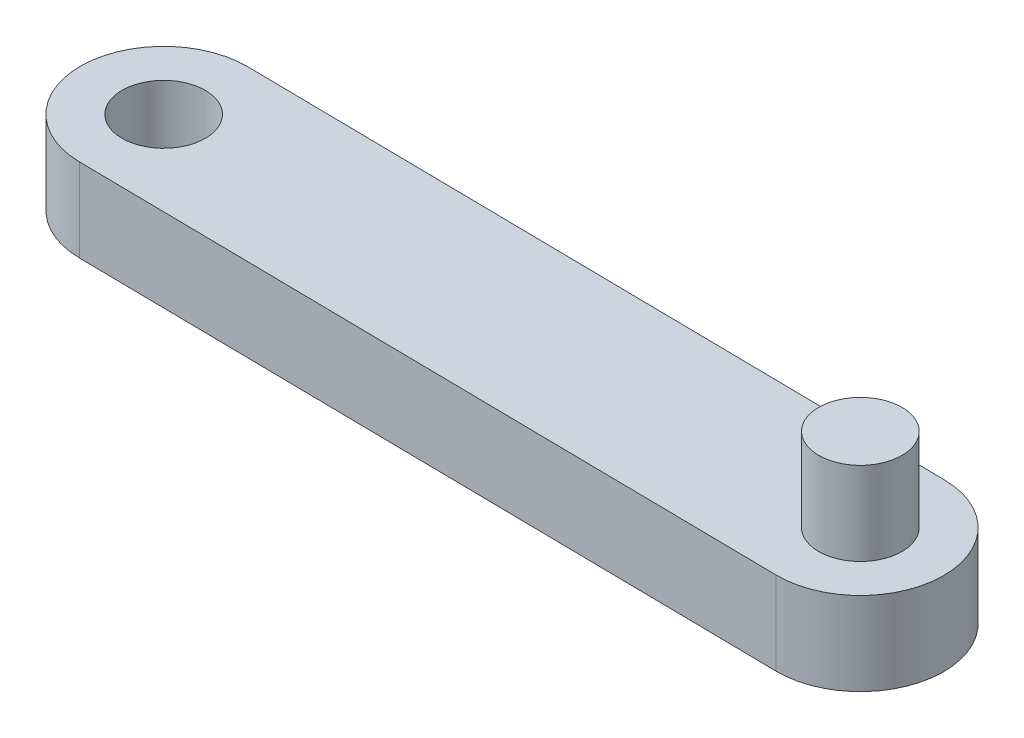
ISO-10303-21;
HEADER;
FILE_DESCRIPTION(('STEP AP214'),'2;1');
FILE_NAME('part.step','',(''),(''),'','','');
FILE_SCHEMA(('AUTOMOTIVE_DESIGN { 1 0 10303 214 1 1 1 1 }'));
ENDSEC;
DATA;
#1=APPLICATION_CONTEXT('core data for automotive mechanical design processes');
#2=APPLICATION_PROTOCOL_DEFINITION('international standard','automotive_design',2000,#1);
#3=PRODUCT_CONTEXT('',#1,'mechanical');
#4=PRODUCT('Part','Part','',(#3));
#5=PRODUCT_RELATED_PRODUCT_CATEGORY('part','',(#4));
#6=PRODUCT_DEFINITION_FORMATION('','',#4);
#7=PRODUCT_DEFINITION_CONTEXT('part definition',#1,'design');
#8=PRODUCT_DEFINITION('design','',#6,#7);
#9=PRODUCT_DEFINITION_SHAPE('','',#8);
#10=(LENGTH_UNIT() NAMED_UNIT(*) SI_UNIT(.MILLI.,.METRE.));
#11=(NAMED_UNIT(*) PLANE_ANGLE_UNIT() SI_UNIT($,.RADIAN.));
#12=(NAMED_UNIT(*) SI_UNIT($,.STERADIAN.) SOLID_ANGLE_UNIT());
#13=UNCERTAINTY_MEASURE_WITH_UNIT(LENGTH_MEASURE(1.E-05),#10,'distance_accuracy_value','');
#14=(GEOMETRIC_REPRESENTATION_CONTEXT(3) GLOBAL_UNCERTAINTY_ASSIGNED_CONTEXT((#13)) GLOBAL_UNIT_ASSIGNED_CONTEXT((#10,
#11,#12)) REPRESENTATION_CONTEXT('',''));
#15=CARTESIAN_POINT('',(0.,0.,0.));
#16=DIRECTION('',(0.,0.,1.));
#17=DIRECTION('',(1.,0.,0.));
#18=AXIS2_PLACEMENT_3D('',#15,#16,#17);
#19=CARTESIAN_POINT('',(-14.5716160355899,5.,-1.70714880270089));
#20=DIRECTION('',(0.,1.,0.));
#21=DIRECTION('',(0.,0.,1.));
#22=AXIS2_PLACEMENT_3D('',#19,#20,#21);
#23=PLANE('',#22);
#24=CARTESIAN_POINT('',(27.8283839644101,5.,-1.1374750982863));
#25=DIRECTION('',(0.,1.,0.));
#26=DIRECTION('',(0.,0.,1.));
#27=AXIS2_PLACEMENT_3D('',#24,#25,#26);
#28=CIRCLE('',#27,2.5);
#29=CARTESIAN_POINT('',(27.8283839644101,5.,1.3625249017137));
#30=VERTEX_POINT('',#29);
#31=EDGE_CURVE('E118',#30,#30,#28,.T.);
#32=ORIENTED_EDGE('',*,*,#31,.F.);
#33=EDGE_LOOP('',(#32));
#34=FACE_BOUND('',#33,.T.);
#35=CARTESIAN_POINT('',(-14.5716160355899,5.,-1.70714880270089));
#36=DIRECTION('',(0.,1.,0.));
#37=DIRECTION('',(0.,0.,1.));
#38=AXIS2_PLACEMENT_3D('',#35,#36,#37);
#39=CIRCLE('',#38,5.);
#40=CARTESIAN_POINT('',(-14.5044435953561,5.,-6.70669756866698));
#41=VERTEX_POINT('',#40);
#42=CARTESIAN_POINT('',(-14.6387884758236,5.,3.2923999632652));
#43=VERTEX_POINT('',#42);
#44=EDGE_CURVE('E85',#41,#43,#39,.T.);
#45=ORIENTED_EDGE('',*,*,#44,.T.);
#46=DIRECTION('',(0.999909753193218,0.,0.013434488046742));
#47=VECTOR('',#46,1.);
#48=CARTESIAN_POINT('',(-14.6387884758236,5.,3.2923999632652));
#49=LINE('',#48,#47);
#50=CARTESIAN_POINT('',(27.7612115241764,5.,3.86207366767979));
#51=VERTEX_POINT('',#50);
#52=EDGE_CURVE('E80',#43,#51,#49,.T.);
#53=ORIENTED_EDGE('',*,*,#52,.T.);
#54=CARTESIAN_POINT('',(27.8283839644101,5.,-1.1374750982863));
#55=DIRECTION('',(0.,1.,0.));
#56=DIRECTION('',(0.,0.,1.));
#57=AXIS2_PLACEMENT_3D('',#54,#55,#56);
#58=CIRCLE('',#57,5.);
#59=CARTESIAN_POINT('',(27.8955564046438,5.,-6.13702386425239));
#60=VERTEX_POINT('',#59);
#61=EDGE_CURVE('E83',#51,#60,#58,.T.);
#62=ORIENTED_EDGE('',*,*,#61,.T.);
#63=DIRECTION('',(-0.999909753193218,0.,-0.013434488046742));
#64=VECTOR('',#63,1.);
#65=CARTESIAN_POINT('',(-14.5044435953561,5.,-6.70669756866698));
#66=LINE('',#65,#64);
#67=EDGE_CURVE('E50',#60,#41,#66,.T.);
#68=ORIENTED_EDGE('',*,*,#67,.T.);
#69=EDGE_LOOP('',(#45,#53,#62,#68));
#70=FACE_BOUND('',#69,.T.);
#71=CARTESIAN_POINT('',(-14.5716160355899,5.,-1.70714880270089));
#72=DIRECTION('',(0.,1.,0.));
#73=DIRECTION('',(0.,0.,1.));
#74=AXIS2_PLACEMENT_3D('',#71,#72,#73);
#75=CIRCLE('',#74,2.5);
#76=CARTESIAN_POINT('',(-14.5716160355899,5.,0.792851197299112));
#77=VERTEX_POINT('',#76);
#78=EDGE_CURVE('E100',#77,#77,#75,.T.);
#79=ORIENTED_EDGE('',*,*,#78,.F.);
#80=EDGE_LOOP('',(#79));
#81=FACE_BOUND('',#80,.T.);
#82=ADVANCED_FACE('F33',(#34,#70,#81),#23,.T.);
#83=CARTESIAN_POINT('',(-14.5716160355899,0.,-1.70714880270089));
#84=DIRECTION('',(0.,1.,0.));
#85=DIRECTION('',(0.,0.,1.));
#86=AXIS2_PLACEMENT_3D('',#83,#84,#85);
#87=PLANE('',#86);
#88=CARTESIAN_POINT('',(-14.5716160355899,0.,-1.70714880270089));
#89=DIRECTION('',(0.,1.,0.));
#90=DIRECTION('',(0.,0.,1.));
#91=AXIS2_PLACEMENT_3D('',#88,#89,#90);
#92=CIRCLE('',#91,5.);
#93=CARTESIAN_POINT('',(-14.5044435953561,0.,-6.70669756866698));
#94=VERTEX_POINT('',#93);
#95=CARTESIAN_POINT('',(-14.6387884758236,0.,3.2923999632652));
#96=VERTEX_POINT('',#95);
#97=EDGE_CURVE('E97',#94,#96,#92,.T.);
#98=ORIENTED_EDGE('',*,*,#97,.F.);
#99=DIRECTION('',(-0.999909753193218,0.,-0.013434488046742));
#100=VECTOR('',#99,1.);
#101=CARTESIAN_POINT('',(-14.5044435953561,0.,-6.70669756866698));
#102=LINE('',#101,#100);
#103=CARTESIAN_POINT('',(27.8955564046438,0.,-6.13702386425239));
#104=VERTEX_POINT('',#103);
#105=EDGE_CURVE('E73',#104,#94,#102,.T.);
#106=ORIENTED_EDGE('',*,*,#105,.F.);
#107=CARTESIAN_POINT('',(27.8283839644101,0.,-1.1374750982863));
#108=DIRECTION('',(0.,1.,0.));
#109=DIRECTION('',(0.,0.,1.));
#110=AXIS2_PLACEMENT_3D('',#107,#108,#109);
#111=CIRCLE('',#110,5.);
#112=CARTESIAN_POINT('',(27.7612115241764,0.,3.86207366767979));
#113=VERTEX_POINT('',#112);
#114=EDGE_CURVE('E67',#113,#104,#111,.T.);
#115=ORIENTED_EDGE('',*,*,#114,.F.);
#116=DIRECTION('',(0.999909753193218,0.,0.013434488046742));
#117=VECTOR('',#116,1.);
#118=CARTESIAN_POINT('',(-14.6387884758236,0.,3.2923999632652));
#119=LINE('',#118,#117);
#120=EDGE_CURVE('E89',#96,#113,#119,.T.);
#121=ORIENTED_EDGE('',*,*,#120,.F.);
#122=EDGE_LOOP('',(#98,#106,#115,#121));
#123=FACE_BOUND('',#122,.T.);
#124=CARTESIAN_POINT('',(-14.5716160355899,0.,-1.70714880270089));
#125=DIRECTION('',(0.,1.,0.));
#126=DIRECTION('',(0.,0.,1.));
#127=AXIS2_PLACEMENT_3D('',#124,#125,#126);
#128=CIRCLE('',#127,2.5);
#129=CARTESIAN_POINT('',(-14.5716160355899,0.,0.792851197299112));
#130=VERTEX_POINT('',#129);
#131=EDGE_CURVE('E112',#130,#130,#128,.T.);
#132=ORIENTED_EDGE('',*,*,#131,.T.);
#133=EDGE_LOOP('',(#132));
#134=FACE_BOUND('',#133,.T.);
#135=ADVANCED_FACE('F108',(#123,#134),#87,.F.);
#136=CARTESIAN_POINT('',(-14.5716160355899,5.,-1.70714880270089));
#137=DIRECTION('',(0.,-1.,0.));
#138=DIRECTION('',(0.,0.,-1.));
#139=AXIS2_PLACEMENT_3D('',#136,#137,#138);
#140=CYLINDRICAL_SURFACE('',#139,5.);
#141=ORIENTED_EDGE('',*,*,#97,.T.);
#142=DIRECTION('',(0.,-1.,0.));
#143=VECTOR('',#142,1.);
#144=CARTESIAN_POINT('',(-14.6387884758236,5.,3.2923999632652));
#145=LINE('',#144,#143);
#146=EDGE_CURVE('E11',#43,#96,#145,.T.);
#147=ORIENTED_EDGE('',*,*,#146,.F.);
#148=ORIENTED_EDGE('',*,*,#44,.F.);
#149=DIRECTION('',(0.,-1.,0.));
#150=VECTOR('',#149,1.);
#151=CARTESIAN_POINT('',(-14.5044435953561,5.,-6.70669756866698));
#152=LINE('',#151,#150);
#153=EDGE_CURVE('E93',#41,#94,#152,.T.);
#154=ORIENTED_EDGE('',*,*,#153,.T.);
#155=EDGE_LOOP('',(#141,#147,#148,#154));
#156=FACE_BOUND('',#155,.T.);
#157=ADVANCED_FACE('F35',(#156),#140,.T.);
#158=CARTESIAN_POINT('',(-14.6387884758236,5.,3.2923999632652));
#159=DIRECTION('',(0.013434488046742,0.,-0.999909753193218));
#160=DIRECTION('',(-0.999909753193218,0.,-0.013434488046742));
#161=AXIS2_PLACEMENT_3D('',#158,#159,#160);
#162=PLANE('',#161);
#163=ORIENTED_EDGE('',*,*,#120,.T.);
#164=DIRECTION('',(0.,-1.,0.));
#165=VECTOR('',#164,1.);
#166=CARTESIAN_POINT('',(27.7612115241764,5.,3.86207366767979));
#167=LINE('',#166,#165);
#168=EDGE_CURVE('E42',#51,#113,#167,.T.);
#169=ORIENTED_EDGE('',*,*,#168,.F.);
#170=ORIENTED_EDGE('',*,*,#52,.F.);
#171=ORIENTED_EDGE('',*,*,#146,.T.);
#172=EDGE_LOOP('',(#163,#169,#170,#171));
#173=FACE_BOUND('',#172,.T.);
#174=ADVANCED_FACE('F88',(#173),#162,.F.);
#175=CARTESIAN_POINT('',(27.8283839644101,5.,-1.1374750982863));
#176=DIRECTION('',(0.,-1.,0.));
#177=DIRECTION('',(0.,0.,-1.));
#178=AXIS2_PLACEMENT_3D('',#175,#176,#177);
#179=CYLINDRICAL_SURFACE('',#178,5.);
#180=ORIENTED_EDGE('',*,*,#114,.T.);
#181=DIRECTION('',(0.,-1.,0.));
#182=VECTOR('',#181,1.);
#183=CARTESIAN_POINT('',(27.8955564046438,5.,-6.13702386425239));
#184=LINE('',#183,#182);
#185=EDGE_CURVE('E90',#60,#104,#184,.T.);
#186=ORIENTED_EDGE('',*,*,#185,.F.);
#187=ORIENTED_EDGE('',*,*,#61,.F.);
#188=ORIENTED_EDGE('',*,*,#168,.T.);
#189=EDGE_LOOP('',(#180,#186,#187,#188));
#190=FACE_BOUND('',#189,.T.);
#191=ADVANCED_FACE('F91',(#190),#179,.T.);
#192=CARTESIAN_POINT('',(-14.5044435953561,5.,-6.70669756866698));
#193=DIRECTION('',(-0.013434488046742,0.,0.999909753193218));
#194=DIRECTION('',(0.999909753193218,0.,0.013434488046742));
#195=AXIS2_PLACEMENT_3D('',#192,#193,#194);
#196=PLANE('',#195);
#197=ORIENTED_EDGE('',*,*,#105,.T.);
#198=ORIENTED_EDGE('',*,*,#153,.F.);
#199=ORIENTED_EDGE('',*,*,#67,.F.);
#200=ORIENTED_EDGE('',*,*,#185,.T.);
#201=EDGE_LOOP('',(#197,#198,#199,#200));
#202=FACE_BOUND('',#201,.T.);
#203=ADVANCED_FACE('F105',(#202),#196,.F.);
#204=CARTESIAN_POINT('',(-14.5716160355899,5.,-1.70714880270089));
#205=DIRECTION('',(0.,-1.,0.));
#206=DIRECTION('',(0.,0.,-1.));
#207=AXIS2_PLACEMENT_3D('',#204,#205,#206);
#208=CYLINDRICAL_SURFACE('',#207,2.5);
#209=ORIENTED_EDGE('',*,*,#78,.T.);
#210=EDGE_LOOP('',(#209));
#211=FACE_BOUND('',#210,.T.);
#212=ORIENTED_EDGE('',*,*,#131,.F.);
#213=EDGE_LOOP('',(#212));
#214=FACE_BOUND('',#213,.T.);
#215=ADVANCED_FACE('F129',(#211,#214),#208,.F.);
#216=CARTESIAN_POINT('',(27.8283839644101,10.,-1.1374750982863));
#217=DIRECTION('',(0.,-1.,0.));
#218=DIRECTION('',(0.,0.,-1.));
#219=AXIS2_PLACEMENT_3D('',#216,#217,#218);
#220=CYLINDRICAL_SURFACE('',#219,2.5);
#221=CARTESIAN_POINT('',(27.8283839644101,10.,-1.1374750982863));
#222=DIRECTION('',(0.,1.,0.));
#223=DIRECTION('',(0.,0.,1.));
#224=AXIS2_PLACEMENT_3D('',#221,#222,#223);
#225=CIRCLE('',#224,2.5);
#226=CARTESIAN_POINT('',(27.8283839644101,10.,1.3625249017137));
#227=VERTEX_POINT('',#226);
#228=EDGE_CURVE('E115',#227,#227,#225,.T.);
#229=ORIENTED_EDGE('',*,*,#228,.F.);
#230=EDGE_LOOP('',(#229));
#231=FACE_BOUND('',#230,.T.);
#232=ORIENTED_EDGE('',*,*,#31,.T.);
#233=EDGE_LOOP('',(#232));
#234=FACE_BOUND('',#233,.T.);
#235=ADVANCED_FACE('F126',(#231,#234),#220,.T.);
#236=CARTESIAN_POINT('',(27.8283839644101,10.,-1.1374750982863));
#237=DIRECTION('',(0.,1.,0.));
#238=DIRECTION('',(0.,0.,1.));
#239=AXIS2_PLACEMENT_3D('',#236,#237,#238);
#240=PLANE('',#239);
#241=ORIENTED_EDGE('',*,*,#228,.T.);
#242=EDGE_LOOP('',(#241));
#243=FACE_BOUND('',#242,.T.);
#244=ADVANCED_FACE('F124',(#243),#240,.T.);
#245=CLOSED_SHELL('',(#82,#135,#157,#174,#191,#203,#215,#235,#244));
#246=MANIFOLD_SOLID_BREP('B2',#245);
#247=ADVANCED_BREP_SHAPE_REPRESENTATION('',(#18,#246),#14);
#248=SHAPE_DEFINITION_REPRESENTATION(#9,#247);
ENDSEC;
END-ISO-10303-21;
